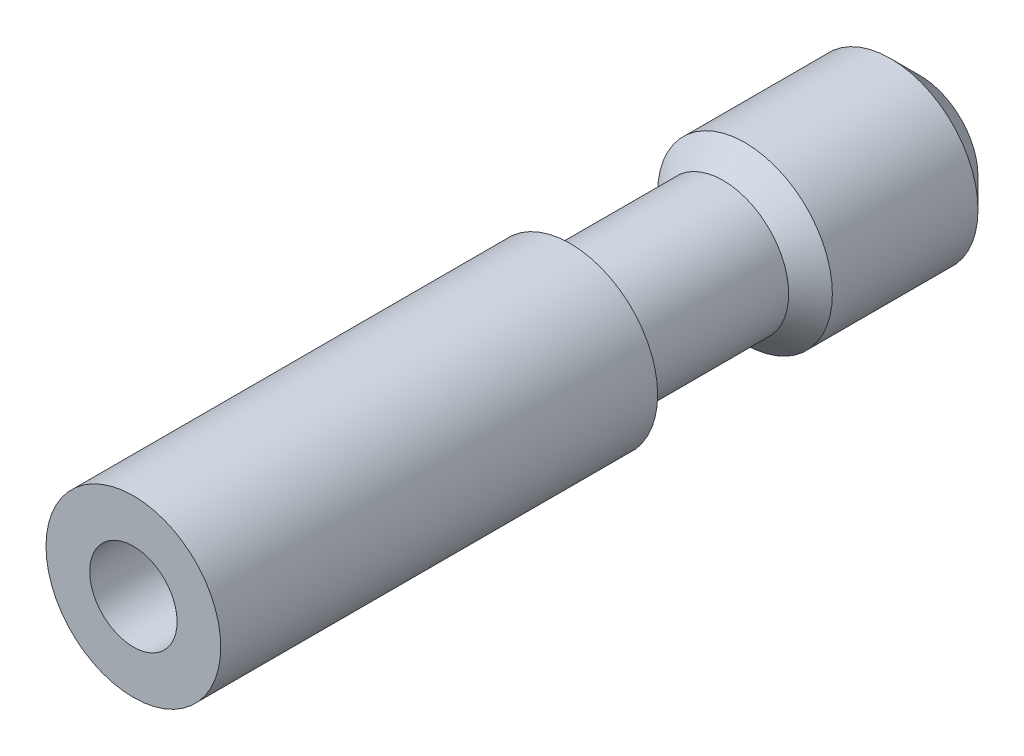
ISO-10303-21;
HEADER;
FILE_DESCRIPTION(('STEP AP214'),'2;1');
FILE_NAME('part.step','',(''),(''),'','','');
FILE_SCHEMA(('AUTOMOTIVE_DESIGN { 1 0 10303 214 1 1 1 1 }'));
ENDSEC;
DATA;
#1=APPLICATION_CONTEXT('core data for automotive mechanical design processes');
#2=APPLICATION_PROTOCOL_DEFINITION('international standard','automotive_design',2000,#1);
#3=PRODUCT_CONTEXT('',#1,'mechanical');
#4=PRODUCT('Part','Part','',(#3));
#5=PRODUCT_RELATED_PRODUCT_CATEGORY('part','',(#4));
#6=PRODUCT_DEFINITION_FORMATION('','',#4);
#7=PRODUCT_DEFINITION_CONTEXT('part definition',#1,'design');
#8=PRODUCT_DEFINITION('design','',#6,#7);
#9=PRODUCT_DEFINITION_SHAPE('','',#8);
#10=(LENGTH_UNIT() NAMED_UNIT(*) SI_UNIT(.MILLI.,.METRE.));
#11=(NAMED_UNIT(*) PLANE_ANGLE_UNIT() SI_UNIT($,.RADIAN.));
#12=(NAMED_UNIT(*) SI_UNIT($,.STERADIAN.) SOLID_ANGLE_UNIT());
#13=UNCERTAINTY_MEASURE_WITH_UNIT(LENGTH_MEASURE(1.E-05),#10,'distance_accuracy_value','');
#14=(GEOMETRIC_REPRESENTATION_CONTEXT(3) GLOBAL_UNCERTAINTY_ASSIGNED_CONTEXT((#13)) GLOBAL_UNIT_ASSIGNED_CONTEXT((#10,
#11,#12)) REPRESENTATION_CONTEXT('',''));
#15=CARTESIAN_POINT('',(0.,0.,0.));
#16=DIRECTION('',(0.,0.,1.));
#17=DIRECTION('',(1.,0.,0.));
#18=AXIS2_PLACEMENT_3D('',#15,#16,#17);
#19=CARTESIAN_POINT('',(0.,0.,27.));
#20=DIRECTION('',(0.,0.,-1.));
#21=DIRECTION('',(-1.,0.,0.));
#22=AXIS2_PLACEMENT_3D('',#19,#20,#21);
#23=CYLINDRICAL_SURFACE('',#22,3.);
#24=CARTESIAN_POINT('',(0.,0.,27.));
#25=DIRECTION('',(0.,0.,1.));
#26=DIRECTION('',(1.,0.,0.));
#27=AXIS2_PLACEMENT_3D('',#24,#25,#26);
#28=CIRCLE('',#27,3.);
#29=CARTESIAN_POINT('',(3.,0.,27.));
#30=VERTEX_POINT('',#29);
#31=EDGE_CURVE('E50',#30,#30,#28,.T.);
#32=ORIENTED_EDGE('',*,*,#31,.F.);
#33=EDGE_LOOP('',(#32));
#34=FACE_BOUND('',#33,.T.);
#35=CARTESIAN_POINT('',(0.,0.,12.));
#36=DIRECTION('',(0.,0.,-1.));
#37=DIRECTION('',(-1.,0.,0.));
#38=AXIS2_PLACEMENT_3D('',#35,#36,#37);
#39=CIRCLE('',#38,3.);
#40=CARTESIAN_POINT('',(-3.,0.,12.));
#41=VERTEX_POINT('',#40);
#42=EDGE_CURVE('E57',#41,#41,#39,.T.);
#43=ORIENTED_EDGE('',*,*,#42,.F.);
#44=EDGE_LOOP('',(#43));
#45=FACE_BOUND('',#44,.T.);
#46=ADVANCED_FACE('F35',(#34,#45),#23,.T.);
#47=CARTESIAN_POINT('',(0.,0.,1.));
#48=DIRECTION('',(0.,0.,1.));
#49=DIRECTION('',(1.,0.,0.));
#50=AXIS2_PLACEMENT_3D('',#47,#48,#49);
#51=CIRCLE('',#50,3.);
#52=CARTESIAN_POINT('',(3.,0.,1.));
#53=VERTEX_POINT('',#52);
#54=EDGE_CURVE('E46',#53,#53,#51,.T.);
#55=ORIENTED_EDGE('',*,*,#54,.T.);
#56=EDGE_LOOP('',(#55));
#57=FACE_BOUND('',#56,.T.);
#58=CARTESIAN_POINT('',(0.,0.,6.));
#59=DIRECTION('',(0.,0.,-1.));
#60=DIRECTION('',(-1.,0.,0.));
#61=AXIS2_PLACEMENT_3D('',#58,#59,#60);
#62=CIRCLE('',#61,3.);
#63=CARTESIAN_POINT('',(-3.,0.,6.));
#64=VERTEX_POINT('',#63);
#65=EDGE_CURVE('E53',#64,#64,#62,.T.);
#66=ORIENTED_EDGE('',*,*,#65,.T.);
#67=EDGE_LOOP('',(#66));
#68=FACE_BOUND('',#67,.T.);
#69=ADVANCED_FACE('F92',(#57,#68),#23,.T.);
#70=CARTESIAN_POINT('',(0.,0.,27.));
#71=DIRECTION('',(0.,0.,1.));
#72=DIRECTION('',(1.,0.,0.));
#73=AXIS2_PLACEMENT_3D('',#70,#71,#72);
#74=PLANE('',#73);
#75=CARTESIAN_POINT('',(0.,0.,27.));
#76=DIRECTION('',(0.,0.,1.));
#77=DIRECTION('',(1.,0.,0.));
#78=AXIS2_PLACEMENT_3D('',#75,#76,#77);
#79=CIRCLE('',#78,1.5);
#80=CARTESIAN_POINT('',(1.5,0.,27.));
#81=VERTEX_POINT('',#80);
#82=EDGE_CURVE('E66',#81,#81,#79,.T.);
#83=ORIENTED_EDGE('',*,*,#82,.F.);
#84=EDGE_LOOP('',(#83));
#85=FACE_BOUND('',#84,.T.);
#86=ORIENTED_EDGE('',*,*,#31,.T.);
#87=EDGE_LOOP('',(#86));
#88=FACE_BOUND('',#87,.T.);
#89=ADVANCED_FACE('F98',(#85,#88),#74,.T.);
#90=CARTESIAN_POINT('',(0.,0.,0.));
#91=DIRECTION('',(0.,0.,1.));
#92=DIRECTION('',(1.,0.,0.));
#93=AXIS2_PLACEMENT_3D('',#90,#91,#92);
#94=PLANE('',#93);
#95=CARTESIAN_POINT('',(0.,0.,0.));
#96=DIRECTION('',(0.,0.,1.));
#97=DIRECTION('',(1.,0.,0.));
#98=AXIS2_PLACEMENT_3D('',#95,#96,#97);
#99=CIRCLE('',#98,2.);
#100=CARTESIAN_POINT('',(2.,0.,0.));
#101=VERTEX_POINT('',#100);
#102=EDGE_CURVE('E42',#101,#101,#99,.F.);
#103=ORIENTED_EDGE('',*,*,#102,.T.);
#104=EDGE_LOOP('',(#103));
#105=FACE_BOUND('',#104,.T.);
#106=CARTESIAN_POINT('',(0.,0.,0.));
#107=DIRECTION('',(0.,0.,-1.));
#108=DIRECTION('',(-1.,0.,0.));
#109=AXIS2_PLACEMENT_3D('',#106,#107,#108);
#110=CIRCLE('',#109,1.25);
#111=CARTESIAN_POINT('',(-1.25,0.,0.));
#112=VERTEX_POINT('',#111);
#113=EDGE_CURVE('E56',#112,#112,#110,.T.);
#114=ORIENTED_EDGE('',*,*,#113,.F.);
#115=EDGE_LOOP('',(#114));
#116=FACE_BOUND('',#115,.T.);
#117=ADVANCED_FACE('F103',(#105,#116),#94,.F.);
#118=CARTESIAN_POINT('',(0.,0.,2.5));
#119=DIRECTION('',(0.,0.,1.));
#120=DIRECTION('',(1.,0.,0.));
#121=AXIS2_PLACEMENT_3D('',#118,#119,#120);
#122=CONICAL_SURFACE('',#121,1.5,1.02974425867665);
#123=CARTESIAN_POINT('',(0.,0.,2.34978484524311));
#124=DIRECTION('',(0.,0.,1.));
#125=DIRECTION('',(1.,0.,0.));
#126=AXIS2_PLACEMENT_3D('',#123,#124,#125);
#127=CIRCLE('',#126,1.25);
#128=CARTESIAN_POINT('',(1.25,0.,2.34978484524311));
#129=VERTEX_POINT('',#128);
#130=EDGE_CURVE('E69',#129,#129,#127,.F.);
#131=ORIENTED_EDGE('',*,*,#130,.T.);
#132=EDGE_LOOP('',(#131));
#133=FACE_BOUND('',#132,.T.);
#134=CARTESIAN_POINT('',(0.,0.,2.5));
#135=DIRECTION('',(0.,0.,1.));
#136=DIRECTION('',(1.,0.,0.));
#137=AXIS2_PLACEMENT_3D('',#134,#135,#136);
#138=CIRCLE('',#137,1.5);
#139=CARTESIAN_POINT('',(1.5,0.,2.5));
#140=VERTEX_POINT('',#139);
#141=EDGE_CURVE('E63',#140,#140,#138,.T.);
#142=ORIENTED_EDGE('',*,*,#141,.T.);
#143=EDGE_LOOP('',(#142));
#144=FACE_BOUND('',#143,.T.);
#145=ADVANCED_FACE('F106',(#133,#144),#122,.F.);
#146=CARTESIAN_POINT('',(0.,0.,27.));
#147=DIRECTION('',(0.,0.,1.));
#148=DIRECTION('',(1.,0.,0.));
#149=AXIS2_PLACEMENT_3D('',#146,#147,#148);
#150=CYLINDRICAL_SURFACE('',#149,1.5);
#151=ORIENTED_EDGE('',*,*,#141,.F.);
#152=EDGE_LOOP('',(#151));
#153=FACE_BOUND('',#152,.T.);
#154=ORIENTED_EDGE('',*,*,#82,.T.);
#155=EDGE_LOOP('',(#154));
#156=FACE_BOUND('',#155,.T.);
#157=ADVANCED_FACE('F112',(#153,#156),#150,.F.);
#158=CARTESIAN_POINT('',(0.,0.,0.));
#159=DIRECTION('',(0.,0.,-1.));
#160=DIRECTION('',(-1.,0.,0.));
#161=AXIS2_PLACEMENT_3D('',#158,#159,#160);
#162=CYLINDRICAL_SURFACE('',#161,1.25);
#163=ORIENTED_EDGE('',*,*,#113,.T.);
#164=EDGE_LOOP('',(#163));
#165=FACE_BOUND('',#164,.T.);
#166=ORIENTED_EDGE('',*,*,#130,.F.);
#167=EDGE_LOOP('',(#166));
#168=FACE_BOUND('',#167,.T.);
#169=ADVANCED_FACE('F89',(#165,#168),#162,.F.);
#170=CARTESIAN_POINT('',(0.,0.,12.));
#171=DIRECTION('',(0.,0.,-1.));
#172=DIRECTION('',(-1.,0.,0.));
#173=AXIS2_PLACEMENT_3D('',#170,#171,#172);
#174=PLANE('',#173);
#175=CARTESIAN_POINT('',(0.,0.,12.));
#176=DIRECTION('',(0.,0.,1.));
#177=DIRECTION('',(1.,0.,0.));
#178=AXIS2_PLACEMENT_3D('',#175,#176,#177);
#179=CIRCLE('',#178,2.25);
#180=CARTESIAN_POINT('',(2.25,0.,12.));
#181=VERTEX_POINT('',#180);
#182=EDGE_CURVE('E60',#181,#181,#179,.T.);
#183=ORIENTED_EDGE('',*,*,#182,.T.);
#184=EDGE_LOOP('',(#183));
#185=FACE_BOUND('',#184,.T.);
#186=ORIENTED_EDGE('',*,*,#42,.T.);
#187=EDGE_LOOP('',(#186));
#188=FACE_BOUND('',#187,.T.);
#189=ADVANCED_FACE('F77',(#185,#188),#174,.T.);
#190=CARTESIAN_POINT('',(0.,0.,6.));
#191=DIRECTION('',(0.,0.,1.));
#192=DIRECTION('',(1.,0.,0.));
#193=AXIS2_PLACEMENT_3D('',#190,#191,#192);
#194=CYLINDRICAL_SURFACE('',#193,2.25);
#195=CARTESIAN_POINT('',(0.,0.,6.75));
#196=DIRECTION('',(0.,0.,-1.));
#197=DIRECTION('',(-1.,0.,0.));
#198=AXIS2_PLACEMENT_3D('',#195,#196,#197);
#199=CIRCLE('',#198,2.25);
#200=CARTESIAN_POINT('',(-2.25,0.,6.75));
#201=VERTEX_POINT('',#200);
#202=EDGE_CURVE('E10',#201,#201,#199,.F.);
#203=ORIENTED_EDGE('',*,*,#202,.T.);
#204=EDGE_LOOP('',(#203));
#205=FACE_BOUND('',#204,.T.);
#206=ORIENTED_EDGE('',*,*,#182,.F.);
#207=EDGE_LOOP('',(#206));
#208=FACE_BOUND('',#207,.T.);
#209=ADVANCED_FACE('F80',(#205,#208),#194,.T.);
#210=CARTESIAN_POINT('',(0.,0.,1.));
#211=DIRECTION('',(0.,0.,1.));
#212=DIRECTION('',(1.,0.,0.));
#213=AXIS2_PLACEMENT_3D('',#210,#211,#212);
#214=CONICAL_SURFACE('',#213,3.,0.78539816339745);
#215=ORIENTED_EDGE('',*,*,#102,.F.);
#216=EDGE_LOOP('',(#215));
#217=FACE_BOUND('',#216,.T.);
#218=ORIENTED_EDGE('',*,*,#54,.F.);
#219=EDGE_LOOP('',(#218));
#220=FACE_BOUND('',#219,.T.);
#221=ADVANCED_FACE('F82',(#217,#220),#214,.T.);
#222=CARTESIAN_POINT('',(0.,0.,6.75));
#223=DIRECTION('',(0.,0.,-1.));
#224=DIRECTION('',(-1.,0.,0.));
#225=AXIS2_PLACEMENT_3D('',#222,#223,#224);
#226=CONICAL_SURFACE('',#225,2.25,0.785398163397445);
#227=ORIENTED_EDGE('',*,*,#65,.F.);
#228=EDGE_LOOP('',(#227));
#229=FACE_BOUND('',#228,.T.);
#230=ORIENTED_EDGE('',*,*,#202,.F.);
#231=EDGE_LOOP('',(#230));
#232=FACE_BOUND('',#231,.T.);
#233=ADVANCED_FACE('F37',(#229,#232),#226,.T.);
#234=CLOSED_SHELL('',(#46,#69,#89,#117,#145,#157,#169,#189,#209,#221,#233));
#235=MANIFOLD_SOLID_BREP('B2',#234);
#236=ADVANCED_BREP_SHAPE_REPRESENTATION('',(#18,#235),#14);
#237=SHAPE_DEFINITION_REPRESENTATION(#9,#236);
ENDSEC;
END-ISO-10303-21;
